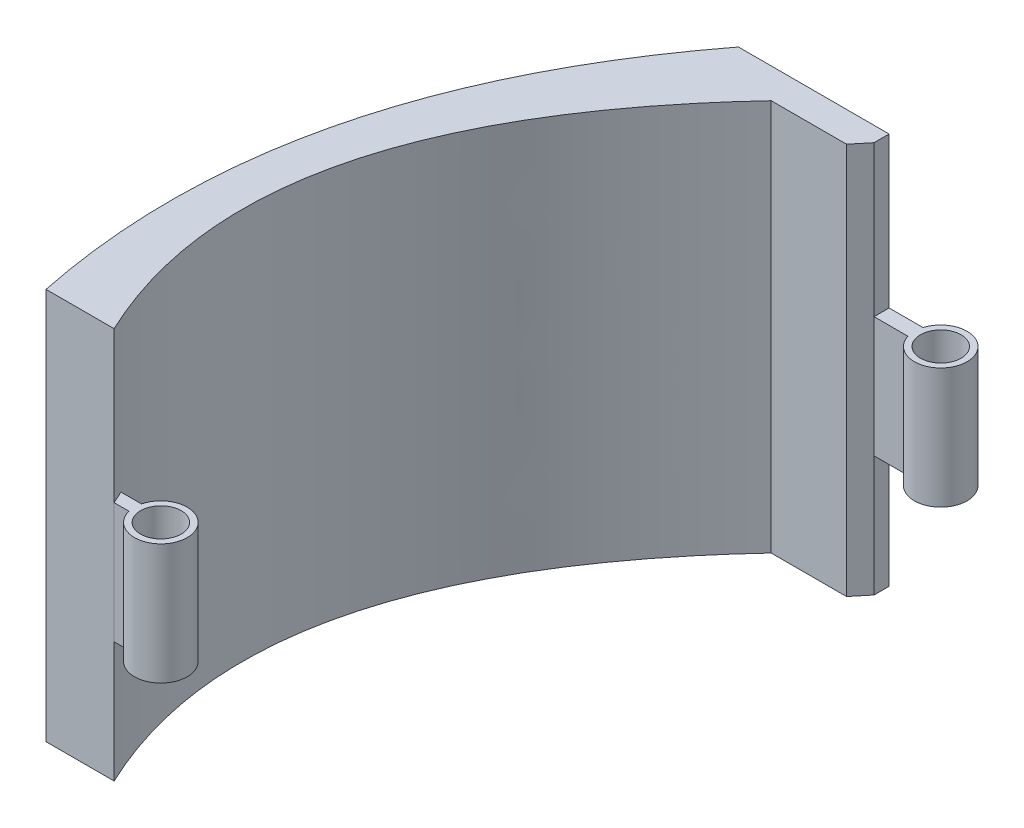
ISO-10303-21;
HEADER;
FILE_DESCRIPTION(('STEP AP214'),'2;1');
FILE_NAME('part.step','',(''),(''),'','','');
FILE_SCHEMA(('AUTOMOTIVE_DESIGN { 1 0 10303 214 1 1 1 1 }'));
ENDSEC;
DATA;
#1=APPLICATION_CONTEXT('core data for automotive mechanical design processes');
#2=APPLICATION_PROTOCOL_DEFINITION('international standard','automotive_design',2000,#1);
#3=PRODUCT_CONTEXT('',#1,'mechanical');
#4=PRODUCT('Part','Part','',(#3));
#5=PRODUCT_RELATED_PRODUCT_CATEGORY('part','',(#4));
#6=PRODUCT_DEFINITION_FORMATION('','',#4);
#7=PRODUCT_DEFINITION_CONTEXT('part definition',#1,'design');
#8=PRODUCT_DEFINITION('design','',#6,#7);
#9=PRODUCT_DEFINITION_SHAPE('','',#8);
#10=(LENGTH_UNIT() NAMED_UNIT(*) SI_UNIT(.MILLI.,.METRE.));
#11=(NAMED_UNIT(*) PLANE_ANGLE_UNIT() SI_UNIT($,.RADIAN.));
#12=(NAMED_UNIT(*) SI_UNIT($,.STERADIAN.) SOLID_ANGLE_UNIT());
#13=UNCERTAINTY_MEASURE_WITH_UNIT(LENGTH_MEASURE(1.E-05),#10,'distance_accuracy_value','');
#14=(GEOMETRIC_REPRESENTATION_CONTEXT(3) GLOBAL_UNCERTAINTY_ASSIGNED_CONTEXT((#13)) GLOBAL_UNIT_ASSIGNED_CONTEXT((#10,
#11,#12)) REPRESENTATION_CONTEXT('',''));
#15=CARTESIAN_POINT('',(0.,0.,0.));
#16=DIRECTION('',(0.,0.,1.));
#17=DIRECTION('',(1.,0.,0.));
#18=AXIS2_PLACEMENT_3D('',#15,#16,#17);
#19=CARTESIAN_POINT('',(-0.380093584955196,8.,-0.835205753797301));
#20=DIRECTION('',(-0.910179756080208,0.,0.414213485562425));
#21=DIRECTION('',(0.414213485562425,0.,0.910179756080208));
#22=AXIS2_PLACEMENT_3D('',#19,#20,#21);
#23=PLANE('',#22);
#24=CARTESIAN_POINT('',(-0.380093584955196,16.,-0.835205753797301));
#25=CARTESIAN_POINT('',(0.,16.,0.));
#26=B_SPLINE_CURVE_WITH_KNOTS('',1,(#24,#25),.UNSPECIFIED.,.F.,.F.,(2,2),(0.,1.),.UNSPECIFIED.);
#27=CARTESIAN_POINT('',(-0.380093584955196,16.,-0.835205753797301));
#28=VERTEX_POINT('',#27);
#29=CARTESIAN_POINT('',(0.,16.,0.));
#30=VERTEX_POINT('',#29);
#31=EDGE_CURVE('E114',#28,#30,#26,.T.);
#32=ORIENTED_EDGE('',*,*,#31,.F.);
#33=DIRECTION('',(0.,1.,0.));
#34=VECTOR('',#33,1.);
#35=CARTESIAN_POINT('',(-0.380093584955196,8.,-0.835205753797301));
#36=LINE('',#35,#34);
#37=CARTESIAN_POINT('',(-0.380093584955196,8.,-0.835205753797301));
#38=VERTEX_POINT('',#37);
#39=EDGE_CURVE('E12',#38,#28,#36,.T.);
#40=ORIENTED_EDGE('',*,*,#39,.F.);
#41=CARTESIAN_POINT('',(-0.380093584955196,8.,-0.835205753797301));
#42=CARTESIAN_POINT('',(0.,8.,0.));
#43=B_SPLINE_CURVE_WITH_KNOTS('',1,(#41,#42),.UNSPECIFIED.,.F.,.F.,(2,2),(0.,1.),.UNSPECIFIED.);
#44=CARTESIAN_POINT('',(0.,8.,0.));
#45=VERTEX_POINT('',#44);
#46=EDGE_CURVE('E105',#38,#45,#43,.T.);
#47=ORIENTED_EDGE('',*,*,#46,.T.);
#48=DIRECTION('',(0.,1.,0.));
#49=VECTOR('',#48,1.);
#50=CARTESIAN_POINT('',(0.,8.,0.));
#51=LINE('',#50,#49);
#52=EDGE_CURVE('E50',#45,#30,#51,.T.);
#53=ORIENTED_EDGE('',*,*,#52,.T.);
#54=EDGE_LOOP('',(#32,#40,#47,#53));
#55=FACE_BOUND('',#54,.T.);
#56=ADVANCED_FACE('F47',(#55),#23,.T.);
#57=CARTESIAN_POINT('',(-0.380093584955196,8.,-0.835205753797301));
#58=DIRECTION('',(0.,0.,-1.));
#59=DIRECTION('',(-1.,0.,0.));
#60=AXIS2_PLACEMENT_3D('',#57,#58,#59);
#61=PLANE('',#60);
#62=DIRECTION('',(-1.,0.,0.));
#63=VECTOR('',#62,1.);
#64=CARTESIAN_POINT('',(-0.380093584955196,16.,-0.835205753797301));
#65=LINE('',#64,#63);
#66=CARTESIAN_POINT('',(0.98695567083012,16.,-0.835205753797301));
#67=VERTEX_POINT('',#66);
#68=EDGE_CURVE('E107',#67,#28,#65,.T.);
#69=ORIENTED_EDGE('',*,*,#68,.F.);
#70=DIRECTION('',(0.,1.,0.));
#71=VECTOR('',#70,1.);
#72=CARTESIAN_POINT('',(0.98695567083012,8.,-0.835205753797301));
#73=LINE('',#72,#71);
#74=CARTESIAN_POINT('',(0.98695567083012,8.,-0.835205753797301));
#75=VERTEX_POINT('',#74);
#76=EDGE_CURVE('E56',#75,#67,#73,.T.);
#77=ORIENTED_EDGE('',*,*,#76,.F.);
#78=DIRECTION('',(-1.,0.,0.));
#79=VECTOR('',#78,1.);
#80=CARTESIAN_POINT('',(-0.380093584955196,8.,-0.835205753797301));
#81=LINE('',#80,#79);
#82=EDGE_CURVE('E102',#75,#38,#81,.T.);
#83=ORIENTED_EDGE('',*,*,#82,.T.);
#84=ORIENTED_EDGE('',*,*,#39,.T.);
#85=EDGE_LOOP('',(#69,#77,#83,#84));
#86=FACE_BOUND('',#85,.T.);
#87=ADVANCED_FACE('F130',(#86),#61,.T.);
#88=CARTESIAN_POINT('',(2.68639906123946,8.,-0.417602876898651));
#89=DIRECTION('',(0.,1.,0.));
#90=DIRECTION('',(0.,0.,1.));
#91=AXIS2_PLACEMENT_3D('',#88,#89,#90);
#92=CYLINDRICAL_SURFACE('',#91,1.75);
#93=CARTESIAN_POINT('',(2.68639906123946,16.,-0.417602876898651));
#94=DIRECTION('',(0.,1.,0.));
#95=DIRECTION('',(0.,0.,1.));
#96=AXIS2_PLACEMENT_3D('',#93,#94,#95);
#97=CIRCLE('',#96,1.75);
#98=CARTESIAN_POINT('',(0.98695567083012,16.,0.));
#99=VERTEX_POINT('',#98);
#100=EDGE_CURVE('E97',#99,#67,#97,.T.);
#101=ORIENTED_EDGE('',*,*,#100,.F.);
#102=DIRECTION('',(0.,1.,0.));
#103=VECTOR('',#102,1.);
#104=CARTESIAN_POINT('',(0.98695567083012,8.,0.));
#105=LINE('',#104,#103);
#106=CARTESIAN_POINT('',(0.98695567083012,8.,0.));
#107=VERTEX_POINT('',#106);
#108=EDGE_CURVE('E92',#107,#99,#105,.T.);
#109=ORIENTED_EDGE('',*,*,#108,.F.);
#110=CARTESIAN_POINT('',(2.68639906123946,8.,-0.417602876898651));
#111=DIRECTION('',(0.,1.,0.));
#112=DIRECTION('',(0.,0.,1.));
#113=AXIS2_PLACEMENT_3D('',#110,#111,#112);
#114=CIRCLE('',#113,1.75);
#115=EDGE_CURVE('E95',#107,#75,#114,.T.);
#116=ORIENTED_EDGE('',*,*,#115,.T.);
#117=ORIENTED_EDGE('',*,*,#76,.T.);
#118=EDGE_LOOP('',(#101,#109,#116,#117));
#119=FACE_BOUND('',#118,.T.);
#120=ADVANCED_FACE('F94',(#119),#92,.T.);
#121=CARTESIAN_POINT('',(0.98695567083012,8.,0.));
#122=DIRECTION('',(0.,0.,1.));
#123=DIRECTION('',(1.,0.,0.));
#124=AXIS2_PLACEMENT_3D('',#121,#122,#123);
#125=PLANE('',#124);
#126=DIRECTION('',(1.,0.,0.));
#127=VECTOR('',#126,1.);
#128=CARTESIAN_POINT('',(0.98695567083012,16.,0.));
#129=LINE('',#128,#127);
#130=EDGE_CURVE('E119',#30,#99,#129,.T.);
#131=ORIENTED_EDGE('',*,*,#130,.F.);
#132=ORIENTED_EDGE('',*,*,#52,.F.);
#133=DIRECTION('',(1.,0.,0.));
#134=VECTOR('',#133,1.);
#135=CARTESIAN_POINT('',(0.98695567083012,8.,0.));
#136=LINE('',#135,#134);
#137=EDGE_CURVE('E101',#45,#107,#136,.T.);
#138=ORIENTED_EDGE('',*,*,#137,.T.);
#139=ORIENTED_EDGE('',*,*,#108,.T.);
#140=EDGE_LOOP('',(#131,#132,#138,#139));
#141=FACE_BOUND('',#140,.T.);
#142=ADVANCED_FACE('F104',(#141),#125,.T.);
#143=CARTESIAN_POINT('',(2.68639906123946,8.,-0.417602876898651));
#144=DIRECTION('',(0.,1.,0.));
#145=DIRECTION('',(0.,0.,1.));
#146=AXIS2_PLACEMENT_3D('',#143,#144,#145);
#147=PLANE('',#146);
#148=CARTESIAN_POINT('',(2.68639906123946,8.,-0.417602876898651));
#149=DIRECTION('',(0.,1.,0.));
#150=DIRECTION('',(0.,0.,1.));
#151=AXIS2_PLACEMENT_3D('',#148,#149,#150);
#152=CIRCLE('',#151,1.35);
#153=CARTESIAN_POINT('',(2.68639906123946,8.,0.93239712310135));
#154=VERTEX_POINT('',#153);
#155=EDGE_CURVE('E120',#154,#154,#152,.T.);
#156=ORIENTED_EDGE('',*,*,#155,.T.);
#157=EDGE_LOOP('',(#156));
#158=FACE_BOUND('',#157,.T.);
#159=ORIENTED_EDGE('',*,*,#46,.F.);
#160=ORIENTED_EDGE('',*,*,#82,.F.);
#161=ORIENTED_EDGE('',*,*,#115,.F.);
#162=ORIENTED_EDGE('',*,*,#137,.F.);
#163=EDGE_LOOP('',(#159,#160,#161,#162));
#164=FACE_BOUND('',#163,.T.);
#165=ADVANCED_FACE('F100',(#158,#164),#147,.F.);
#166=CARTESIAN_POINT('',(2.68639906123946,16.,-0.417602876898651));
#167=DIRECTION('',(0.,1.,0.));
#168=DIRECTION('',(0.,0.,1.));
#169=AXIS2_PLACEMENT_3D('',#166,#167,#168);
#170=PLANE('',#169);
#171=CARTESIAN_POINT('',(2.68639906123946,16.,-0.417602876898651));
#172=DIRECTION('',(0.,1.,0.));
#173=DIRECTION('',(0.,0.,1.));
#174=AXIS2_PLACEMENT_3D('',#171,#172,#173);
#175=CIRCLE('',#174,1.35);
#176=CARTESIAN_POINT('',(2.68639906123946,16.,0.93239712310135));
#177=VERTEX_POINT('',#176);
#178=EDGE_CURVE('E159',#177,#177,#175,.T.);
#179=ORIENTED_EDGE('',*,*,#178,.F.);
#180=EDGE_LOOP('',(#179));
#181=FACE_BOUND('',#180,.T.);
#182=ORIENTED_EDGE('',*,*,#31,.T.);
#183=ORIENTED_EDGE('',*,*,#130,.T.);
#184=ORIENTED_EDGE('',*,*,#100,.T.);
#185=ORIENTED_EDGE('',*,*,#68,.T.);
#186=EDGE_LOOP('',(#182,#183,#184,#185));
#187=FACE_BOUND('',#186,.T.);
#188=ADVANCED_FACE('F129',(#181,#187),#170,.T.);
#189=CARTESIAN_POINT('',(2.68639906123946,0.,-0.417602876898651));
#190=DIRECTION('',(0.,1.,0.));
#191=DIRECTION('',(0.,0.,1.));
#192=AXIS2_PLACEMENT_3D('',#189,#190,#191);
#193=CYLINDRICAL_SURFACE('',#192,1.35);
#194=ORIENTED_EDGE('',*,*,#178,.T.);
#195=EDGE_LOOP('',(#194));
#196=FACE_BOUND('',#195,.T.);
#197=ORIENTED_EDGE('',*,*,#155,.F.);
#198=EDGE_LOOP('',(#197));
#199=FACE_BOUND('',#198,.T.);
#200=ADVANCED_FACE('F148',(#196,#199),#193,.F.);
#201=CLOSED_SHELL('',(#56,#87,#120,#142,#165,#188,#200));
#202=MANIFOLD_SOLID_BREP('B2',#201);
#203=CARTESIAN_POINT('',(14.5285083041094,26.,-36.9071862854208));
#204=DIRECTION('',(-1.,0.,0.));
#205=DIRECTION('',(0.,0.,1.));
#206=AXIS2_PLACEMENT_3D('',#203,#204,#205);
#207=PLANE('',#206);
#208=DIRECTION('',(0.,0.,1.));
#209=VECTOR('',#208,1.);
#210=CARTESIAN_POINT('',(14.5285083041094,16.,-35.9071862854208));
#211=LINE('',#210,#209);
#212=CARTESIAN_POINT('',(14.5285083041094,16.,-36.9071862854208));
#213=VERTEX_POINT('',#212);
#214=CARTESIAN_POINT('',(14.5285083041094,16.,-35.9071862854208));
#215=VERTEX_POINT('',#214);
#216=EDGE_CURVE('E379',#213,#215,#211,.T.);
#217=ORIENTED_EDGE('',*,*,#216,.F.);
#218=DIRECTION('',(0.,-1.,0.));
#219=VECTOR('',#218,1.);
#220=CARTESIAN_POINT('',(14.5285083041094,26.,-36.9071862854208));
#221=LINE('',#220,#219);
#222=CARTESIAN_POINT('',(14.5285083041094,26.,-36.9071862854208));
#223=VERTEX_POINT('',#222);
#224=EDGE_CURVE('E303',#223,#213,#221,.T.);
#225=ORIENTED_EDGE('',*,*,#224,.F.);
#226=DIRECTION('',(0.,0.,-1.));
#227=VECTOR('',#226,1.);
#228=CARTESIAN_POINT('',(14.5285083041094,26.,-36.9071862854208));
#229=LINE('',#228,#227);
#230=CARTESIAN_POINT('',(14.5285083041094,26.,-35.9071862854208));
#231=VERTEX_POINT('',#230);
#232=EDGE_CURVE('E281',#231,#223,#229,.T.);
#233=ORIENTED_EDGE('',*,*,#232,.F.);
#234=DIRECTION('',(0.,-1.,0.));
#235=VECTOR('',#234,1.);
#236=CARTESIAN_POINT('',(14.5285083041094,26.,-35.9071862854208));
#237=LINE('',#236,#235);
#238=EDGE_CURVE('E291',#231,#215,#237,.T.);
#239=ORIENTED_EDGE('',*,*,#238,.T.);
#240=EDGE_LOOP('',(#217,#225,#233,#239));
#241=FACE_BOUND('',#240,.T.);
#242=ADVANCED_FACE('F202',(#241),#207,.F.);
#243=CARTESIAN_POINT('',(4.52850830410939,26.,-36.9071862854208));
#244=CARTESIAN_POINT('',(-8.60017280516398,26.,-19.7975756336284));
#245=CARTESIAN_POINT('',(-4.51912124695227,26.,0.));
#246=B_SPLINE_CURVE_WITH_KNOTS('',2,(#243,#244,#245),.UNSPECIFIED.,.F.,.F.,(3,3),(0.,1.),.UNSPECIFIED.);
#247=DIRECTION('',(0.,-1.,0.));
#248=VECTOR('',#247,1.);
#249=SURFACE_OF_LINEAR_EXTRUSION('',#246,#248);
#250=CARTESIAN_POINT('',(4.52850830410939,0.,-36.9071862854208));
#251=CARTESIAN_POINT('',(-8.60017280516398,0.,-19.7975756336284));
#252=CARTESIAN_POINT('',(-4.51912124695227,0.,0.));
#253=B_SPLINE_CURVE_WITH_KNOTS('',2,(#250,#251,#252),.UNSPECIFIED.,.F.,.F.,(3,3),(0.,1.),.UNSPECIFIED.);
#254=CARTESIAN_POINT('',(4.52850830410939,0.,-36.9071862854208));
#255=VERTEX_POINT('',#254);
#256=CARTESIAN_POINT('',(-4.51912124695227,0.,0.));
#257=VERTEX_POINT('',#256);
#258=EDGE_CURVE('E309',#255,#257,#253,.T.);
#259=ORIENTED_EDGE('',*,*,#258,.T.);
#260=DIRECTION('',(0.,-1.,0.));
#261=VECTOR('',#260,1.);
#262=CARTESIAN_POINT('',(-4.51912124695227,26.,0.));
#263=LINE('',#262,#261);
#264=CARTESIAN_POINT('',(-4.51912124695227,26.,0.));
#265=VERTEX_POINT('',#264);
#266=EDGE_CURVE('E45',#265,#257,#263,.T.);
#267=ORIENTED_EDGE('',*,*,#266,.F.);
#268=CARTESIAN_POINT('',(4.52850830410939,26.,-36.9071862854208));
#269=VERTEX_POINT('',#268);
#270=EDGE_CURVE('E335',#269,#265,#246,.T.);
#271=ORIENTED_EDGE('',*,*,#270,.F.);
#272=DIRECTION('',(0.,-1.,0.));
#273=VECTOR('',#272,1.);
#274=CARTESIAN_POINT('',(4.52850830410939,26.,-36.9071862854208));
#275=LINE('',#274,#273);
#276=EDGE_CURVE('E305',#269,#255,#275,.T.);
#277=ORIENTED_EDGE('',*,*,#276,.T.);
#278=EDGE_LOOP('',(#259,#267,#271,#277));
#279=FACE_BOUND('',#278,.T.);
#280=ADVANCED_FACE('F204',(#279),#249,.F.);
#281=CARTESIAN_POINT('',(-4.51912124695227,26.,0.));
#282=DIRECTION('',(0.,0.,-1.));
#283=DIRECTION('',(-1.,0.,0.));
#284=AXIS2_PLACEMENT_3D('',#281,#282,#283);
#285=PLANE('',#284);
#286=DIRECTION('',(1.,0.,0.));
#287=VECTOR('',#286,1.);
#288=CARTESIAN_POINT('',(-4.51912124695227,0.,0.));
#289=LINE('',#288,#287);
#290=CARTESIAN_POINT('',(0.,0.,0.));
#291=VERTEX_POINT('',#290);
#292=EDGE_CURVE('E314',#257,#291,#289,.T.);
#293=ORIENTED_EDGE('',*,*,#292,.T.);
#294=DIRECTION('',(0.,-1.,0.));
#295=VECTOR('',#294,1.);
#296=CARTESIAN_POINT('',(0.,26.,0.));
#297=LINE('',#296,#295);
#298=CARTESIAN_POINT('',(0.,26.,0.));
#299=VERTEX_POINT('',#298);
#300=EDGE_CURVE('E211',#299,#291,#297,.T.);
#301=ORIENTED_EDGE('',*,*,#300,.F.);
#302=DIRECTION('',(1.,0.,0.));
#303=VECTOR('',#302,1.);
#304=CARTESIAN_POINT('',(-4.51912124695227,26.,0.));
#305=LINE('',#304,#303);
#306=EDGE_CURVE('E264',#265,#299,#305,.T.);
#307=ORIENTED_EDGE('',*,*,#306,.F.);
#308=ORIENTED_EDGE('',*,*,#266,.T.);
#309=EDGE_LOOP('',(#293,#301,#307,#308));
#310=FACE_BOUND('',#309,.T.);
#311=ADVANCED_FACE('F409',(#310),#285,.F.);
#312=CARTESIAN_POINT('',(0.,26.,0.));
#313=CARTESIAN_POINT('',(-8.04789533432413,26.,-17.0045130847505));
#314=CARTESIAN_POINT('',(8.70204481317038,26.,-34.9071862854208));
#315=B_SPLINE_CURVE_WITH_KNOTS('',2,(#312,#313,#314),.UNSPECIFIED.,.F.,.F.,(3,3),(0.,1.),.UNSPECIFIED.);
#316=DIRECTION('',(0.,-1.,0.));
#317=VECTOR('',#316,1.);
#318=SURFACE_OF_LINEAR_EXTRUSION('',#315,#317);
#319=CARTESIAN_POINT('',(0.,0.,0.));
#320=CARTESIAN_POINT('',(-8.04789533432413,0.,-17.0045130847505));
#321=CARTESIAN_POINT('',(8.70204481317038,0.,-34.9071862854208));
#322=B_SPLINE_CURVE_WITH_KNOTS('',2,(#319,#320,#321),.UNSPECIFIED.,.F.,.F.,(3,3),(0.,1.),.UNSPECIFIED.);
#323=CARTESIAN_POINT('',(8.70204481317038,0.,-34.9071862854208));
#324=VERTEX_POINT('',#323);
#325=EDGE_CURVE('E320',#291,#324,#322,.T.);
#326=ORIENTED_EDGE('',*,*,#325,.T.);
#327=DIRECTION('',(0.,-1.,0.));
#328=VECTOR('',#327,1.);
#329=CARTESIAN_POINT('',(8.70204481317038,26.,-34.9071862854208));
#330=LINE('',#329,#328);
#331=CARTESIAN_POINT('',(8.70204481317038,26.,-34.9071862854208));
#332=VERTEX_POINT('',#331);
#333=EDGE_CURVE('E340',#332,#324,#330,.T.);
#334=ORIENTED_EDGE('',*,*,#333,.F.);
#335=EDGE_CURVE('E348',#299,#332,#315,.T.);
#336=ORIENTED_EDGE('',*,*,#335,.F.);
#337=ORIENTED_EDGE('',*,*,#300,.T.);
#338=EDGE_LOOP('',(#326,#334,#336,#337));
#339=FACE_BOUND('',#338,.T.);
#340=ADVANCED_FACE('F346',(#339),#318,.F.);
#341=CARTESIAN_POINT('',(13.7020448131704,26.,-34.9071862854208));
#342=DIRECTION('',(0.,0.,-1.));
#343=DIRECTION('',(-1.,0.,0.));
#344=AXIS2_PLACEMENT_3D('',#341,#342,#343);
#345=PLANE('',#344);
#346=DIRECTION('',(1.,0.,0.));
#347=VECTOR('',#346,1.);
#348=CARTESIAN_POINT('',(13.7020448131704,0.,-34.9071862854208));
#349=LINE('',#348,#347);
#350=CARTESIAN_POINT('',(13.7020448131704,0.,-34.9071862854208));
#351=VERTEX_POINT('',#350);
#352=EDGE_CURVE('E324',#324,#351,#349,.T.);
#353=ORIENTED_EDGE('',*,*,#352,.T.);
#354=DIRECTION('',(0.,-1.,0.));
#355=VECTOR('',#354,1.);
#356=CARTESIAN_POINT('',(13.7020448131704,26.,-34.9071862854208));
#357=LINE('',#356,#355);
#358=CARTESIAN_POINT('',(13.7020448131704,26.,-34.9071862854208));
#359=VERTEX_POINT('',#358);
#360=EDGE_CURVE('E299',#359,#351,#357,.T.);
#361=ORIENTED_EDGE('',*,*,#360,.F.);
#362=DIRECTION('',(1.,0.,0.));
#363=VECTOR('',#362,1.);
#364=CARTESIAN_POINT('',(13.7020448131704,26.,-34.9071862854208));
#365=LINE('',#364,#363);
#366=EDGE_CURVE('E284',#332,#359,#365,.T.);
#367=ORIENTED_EDGE('',*,*,#366,.F.);
#368=ORIENTED_EDGE('',*,*,#333,.T.);
#369=EDGE_LOOP('',(#353,#361,#367,#368));
#370=FACE_BOUND('',#369,.T.);
#371=ADVANCED_FACE('F356',(#370),#345,.F.);
#372=CARTESIAN_POINT('',(14.5285083041094,26.,-35.9071862854208));
#373=DIRECTION('',(-0.770819221241379,0.,-0.637053944470037));
#374=DIRECTION('',(-0.637053944470037,0.,0.77081922124138));
#375=AXIS2_PLACEMENT_3D('',#372,#373,#374);
#376=PLANE('',#375);
#377=DIRECTION('',(0.637053944470037,0.,-0.770819221241379));
#378=VECTOR('',#377,1.);
#379=CARTESIAN_POINT('',(14.5285083041094,0.,-35.9071862854208));
#380=LINE('',#379,#378);
#381=CARTESIAN_POINT('',(14.5285083041094,0.,-35.9071862854208));
#382=VERTEX_POINT('',#381);
#383=EDGE_CURVE('E329',#351,#382,#380,.T.);
#384=ORIENTED_EDGE('',*,*,#383,.T.);
#385=CARTESIAN_POINT('',(14.5285083041094,8.00000000000001,-35.9071862854208));
#386=VERTEX_POINT('',#385);
#387=EDGE_CURVE('E300',#386,#382,#237,.T.);
#388=ORIENTED_EDGE('',*,*,#387,.F.);
#389=DIRECTION('',(0.,1.,0.));
#390=VECTOR('',#389,1.);
#391=CARTESIAN_POINT('',(14.5285083041094,8.,-35.9071862854208));
#392=LINE('',#391,#390);
#393=EDGE_CURVE('E296',#386,#215,#392,.T.);
#394=ORIENTED_EDGE('',*,*,#393,.T.);
#395=ORIENTED_EDGE('',*,*,#238,.F.);
#396=DIRECTION('',(0.637053944470037,0.,-0.770819221241379));
#397=VECTOR('',#396,1.);
#398=CARTESIAN_POINT('',(14.5285083041094,26.,-35.9071862854208));
#399=LINE('',#398,#397);
#400=EDGE_CURVE('E277',#359,#231,#399,.T.);
#401=ORIENTED_EDGE('',*,*,#400,.F.);
#402=ORIENTED_EDGE('',*,*,#360,.T.);
#403=EDGE_LOOP('',(#384,#388,#394,#395,#401,#402));
#404=FACE_BOUND('',#403,.T.);
#405=ADVANCED_FACE('F293',(#404),#376,.F.);
#406=CARTESIAN_POINT('',(14.5285083041094,8.,-36.9071862854208));
#407=VERTEX_POINT('',#406);
#408=CARTESIAN_POINT('',(14.5285083041094,0.,-36.9071862854208));
#409=VERTEX_POINT('',#408);
#410=EDGE_CURVE('E337',#407,#409,#221,.T.);
#411=ORIENTED_EDGE('',*,*,#410,.F.);
#412=DIRECTION('',(0.,0.,1.));
#413=VECTOR('',#412,1.);
#414=CARTESIAN_POINT('',(14.5285083041094,8.,-35.9071862854208));
#415=LINE('',#414,#413);
#416=EDGE_CURVE('E361',#407,#386,#415,.T.);
#417=ORIENTED_EDGE('',*,*,#416,.T.);
#418=ORIENTED_EDGE('',*,*,#387,.T.);
#419=DIRECTION('',(0.,0.,-1.));
#420=VECTOR('',#419,1.);
#421=CARTESIAN_POINT('',(14.5285083041094,0.,-36.9071862854208));
#422=LINE('',#421,#420);
#423=EDGE_CURVE('E331',#382,#409,#422,.T.);
#424=ORIENTED_EDGE('',*,*,#423,.T.);
#425=EDGE_LOOP('',(#411,#417,#418,#424));
#426=FACE_BOUND('',#425,.T.);
#427=ADVANCED_FACE('F359',(#426),#207,.F.);
#428=CARTESIAN_POINT('',(4.52850830410939,26.,-36.9071862854208));
#429=DIRECTION('',(0.,0.,1.));
#430=DIRECTION('',(1.,0.,0.));
#431=AXIS2_PLACEMENT_3D('',#428,#429,#430);
#432=PLANE('',#431);
#433=DIRECTION('',(-1.,0.,0.));
#434=VECTOR('',#433,1.);
#435=CARTESIAN_POINT('',(4.52850830410939,0.,-36.9071862854208));
#436=LINE('',#435,#434);
#437=EDGE_CURVE('E256',#409,#255,#436,.T.);
#438=ORIENTED_EDGE('',*,*,#437,.T.);
#439=ORIENTED_EDGE('',*,*,#276,.F.);
#440=DIRECTION('',(-1.,0.,0.));
#441=VECTOR('',#440,1.);
#442=CARTESIAN_POINT('',(4.52850830410939,26.,-36.9071862854208));
#443=LINE('',#442,#441);
#444=EDGE_CURVE('E227',#223,#269,#443,.T.);
#445=ORIENTED_EDGE('',*,*,#444,.F.);
#446=ORIENTED_EDGE('',*,*,#224,.T.);
#447=DIRECTION('',(-1.,0.,0.));
#448=VECTOR('',#447,1.);
#449=CARTESIAN_POINT('',(14.5285083041094,16.,-36.9071862854208));
#450=LINE('',#449,#448);
#451=CARTESIAN_POINT('',(16.7785083041094,16.,-36.9071862854208));
#452=VERTEX_POINT('',#451);
#453=EDGE_CURVE('E364',#452,#213,#450,.T.);
#454=ORIENTED_EDGE('',*,*,#453,.F.);
#455=DIRECTION('',(0.,1.,0.));
#456=VECTOR('',#455,1.);
#457=CARTESIAN_POINT('',(16.7785083041094,8.,-36.9071862854208));
#458=LINE('',#457,#456);
#459=CARTESIAN_POINT('',(16.7785083041094,8.,-36.9071862854208));
#460=VERTEX_POINT('',#459);
#461=EDGE_CURVE('E315',#460,#452,#458,.T.);
#462=ORIENTED_EDGE('',*,*,#461,.F.);
#463=DIRECTION('',(-1.,0.,0.));
#464=VECTOR('',#463,1.);
#465=CARTESIAN_POINT('',(14.5285083041094,8.,-36.9071862854208));
#466=LINE('',#465,#464);
#467=EDGE_CURVE('E377',#460,#407,#466,.T.);
#468=ORIENTED_EDGE('',*,*,#467,.T.);
#469=ORIENTED_EDGE('',*,*,#410,.T.);
#470=EDGE_LOOP('',(#438,#439,#445,#446,#454,#462,#468,#469));
#471=FACE_BOUND('',#470,.T.);
#472=ADVANCED_FACE('F422',(#471),#432,.F.);
#473=CARTESIAN_POINT('',(-4.29773963829271,26.,-19.1255843881694));
#474=DIRECTION('',(0.,1.,0.));
#475=DIRECTION('',(0.,0.,1.));
#476=AXIS2_PLACEMENT_3D('',#473,#474,#475);
#477=PLANE('',#476);
#478=ORIENTED_EDGE('',*,*,#270,.T.);
#479=ORIENTED_EDGE('',*,*,#306,.T.);
#480=ORIENTED_EDGE('',*,*,#335,.T.);
#481=ORIENTED_EDGE('',*,*,#366,.T.);
#482=ORIENTED_EDGE('',*,*,#400,.T.);
#483=ORIENTED_EDGE('',*,*,#232,.T.);
#484=ORIENTED_EDGE('',*,*,#444,.T.);
#485=EDGE_LOOP('',(#478,#479,#480,#481,#482,#483,#484));
#486=FACE_BOUND('',#485,.T.);
#487=ADVANCED_FACE('F279',(#486),#477,.T.);
#488=CARTESIAN_POINT('',(-4.29773963829271,0.,-19.1255843881694));
#489=DIRECTION('',(0.,1.,0.));
#490=DIRECTION('',(0.,0.,1.));
#491=AXIS2_PLACEMENT_3D('',#488,#489,#490);
#492=PLANE('',#491);
#493=ORIENTED_EDGE('',*,*,#258,.F.);
#494=ORIENTED_EDGE('',*,*,#437,.F.);
#495=ORIENTED_EDGE('',*,*,#423,.F.);
#496=ORIENTED_EDGE('',*,*,#383,.F.);
#497=ORIENTED_EDGE('',*,*,#352,.F.);
#498=ORIENTED_EDGE('',*,*,#325,.F.);
#499=ORIENTED_EDGE('',*,*,#292,.F.);
#500=EDGE_LOOP('',(#493,#494,#495,#496,#497,#498,#499));
#501=FACE_BOUND('',#500,.T.);
#502=ADVANCED_FACE('F352',(#501),#492,.F.);
#503=CARTESIAN_POINT('',(18.4555592872342,8.,-36.4071862854208));
#504=DIRECTION('',(0.,1.,0.));
#505=DIRECTION('',(0.,0.,1.));
#506=AXIS2_PLACEMENT_3D('',#503,#504,#505);
#507=CYLINDRICAL_SURFACE('',#506,1.75);
#508=CARTESIAN_POINT('',(18.4555592872342,16.,-36.4071862854208));
#509=DIRECTION('',(0.,1.,0.));
#510=DIRECTION('',(0.,0.,1.));
#511=AXIS2_PLACEMENT_3D('',#508,#509,#510);
#512=CIRCLE('',#511,1.75);
#513=CARTESIAN_POINT('',(16.7785083041094,16.,-35.9071862854208));
#514=VERTEX_POINT('',#513);
#515=EDGE_CURVE('E369',#514,#452,#512,.T.);
#516=ORIENTED_EDGE('',*,*,#515,.F.);
#517=DIRECTION('',(0.,1.,0.));
#518=VECTOR('',#517,1.);
#519=CARTESIAN_POINT('',(16.7785083041094,8.,-35.9071862854208));
#520=LINE('',#519,#518);
#521=CARTESIAN_POINT('',(16.7785083041094,8.,-35.9071862854208));
#522=VERTEX_POINT('',#521);
#523=EDGE_CURVE('E389',#522,#514,#520,.T.);
#524=ORIENTED_EDGE('',*,*,#523,.F.);
#525=CARTESIAN_POINT('',(18.4555592872342,8.,-36.4071862854208));
#526=DIRECTION('',(0.,1.,0.));
#527=DIRECTION('',(0.,0.,1.));
#528=AXIS2_PLACEMENT_3D('',#525,#526,#527);
#529=CIRCLE('',#528,1.75);
#530=EDGE_CURVE('E366',#522,#460,#529,.T.);
#531=ORIENTED_EDGE('',*,*,#530,.T.);
#532=ORIENTED_EDGE('',*,*,#461,.T.);
#533=EDGE_LOOP('',(#516,#524,#531,#532));
#534=FACE_BOUND('',#533,.T.);
#535=ADVANCED_FACE('F481',(#534),#507,.T.);
#536=CARTESIAN_POINT('',(16.7785083041094,8.,-35.9071862854208));
#537=DIRECTION('',(0.,0.,1.));
#538=DIRECTION('',(1.,0.,0.));
#539=AXIS2_PLACEMENT_3D('',#536,#537,#538);
#540=PLANE('',#539);
#541=DIRECTION('',(1.,0.,0.));
#542=VECTOR('',#541,1.);
#543=CARTESIAN_POINT('',(16.7785083041094,16.,-35.9071862854208));
#544=LINE('',#543,#542);
#545=EDGE_CURVE('E382',#215,#514,#544,.T.);
#546=ORIENTED_EDGE('',*,*,#545,.F.);
#547=ORIENTED_EDGE('',*,*,#393,.F.);
#548=DIRECTION('',(1.,0.,0.));
#549=VECTOR('',#548,1.);
#550=CARTESIAN_POINT('',(16.7785083041094,8.,-35.9071862854208));
#551=LINE('',#550,#549);
#552=EDGE_CURVE('E218',#386,#522,#551,.T.);
#553=ORIENTED_EDGE('',*,*,#552,.T.);
#554=ORIENTED_EDGE('',*,*,#523,.T.);
#555=EDGE_LOOP('',(#546,#547,#553,#554));
#556=FACE_BOUND('',#555,.T.);
#557=ADVANCED_FACE('F493',(#556),#540,.T.);
#558=CARTESIAN_POINT('',(18.4555592872342,8.,-36.4071862854208));
#559=DIRECTION('',(0.,1.,0.));
#560=DIRECTION('',(0.,0.,1.));
#561=AXIS2_PLACEMENT_3D('',#558,#559,#560);
#562=PLANE('',#561);
#563=CARTESIAN_POINT('',(18.4555592872342,8.,-36.4071862854208));
#564=DIRECTION('',(0.,1.,0.));
#565=DIRECTION('',(0.,0.,1.));
#566=AXIS2_PLACEMENT_3D('',#563,#564,#565);
#567=CIRCLE('',#566,1.35);
#568=CARTESIAN_POINT('',(18.4555592872342,8.,-35.0571862854208));
#569=VERTEX_POINT('',#568);
#570=EDGE_CURVE('E372',#569,#569,#567,.T.);
#571=ORIENTED_EDGE('',*,*,#570,.T.);
#572=EDGE_LOOP('',(#571));
#573=FACE_BOUND('',#572,.T.);
#574=ORIENTED_EDGE('',*,*,#416,.F.);
#575=ORIENTED_EDGE('',*,*,#467,.F.);
#576=ORIENTED_EDGE('',*,*,#530,.F.);
#577=ORIENTED_EDGE('',*,*,#552,.F.);
#578=EDGE_LOOP('',(#574,#575,#576,#577));
#579=FACE_BOUND('',#578,.T.);
#580=ADVANCED_FACE('F500',(#573,#579),#562,.F.);
#581=CARTESIAN_POINT('',(18.4555592872342,16.,-36.4071862854208));
#582=DIRECTION('',(0.,1.,0.));
#583=DIRECTION('',(0.,0.,1.));
#584=AXIS2_PLACEMENT_3D('',#581,#582,#583);
#585=PLANE('',#584);
#586=CARTESIAN_POINT('',(18.4555592872342,16.,-36.4071862854208));
#587=DIRECTION('',(0.,1.,0.));
#588=DIRECTION('',(0.,0.,1.));
#589=AXIS2_PLACEMENT_3D('',#586,#587,#588);
#590=CIRCLE('',#589,1.35);
#591=CARTESIAN_POINT('',(18.4555592872342,16.,-35.0571862854208));
#592=VERTEX_POINT('',#591);
#593=EDGE_CURVE('E540',#592,#592,#590,.T.);
#594=ORIENTED_EDGE('',*,*,#593,.F.);
#595=EDGE_LOOP('',(#594));
#596=FACE_BOUND('',#595,.T.);
#597=ORIENTED_EDGE('',*,*,#216,.T.);
#598=ORIENTED_EDGE('',*,*,#545,.T.);
#599=ORIENTED_EDGE('',*,*,#515,.T.);
#600=ORIENTED_EDGE('',*,*,#453,.T.);
#601=EDGE_LOOP('',(#597,#598,#599,#600));
#602=FACE_BOUND('',#601,.T.);
#603=ADVANCED_FACE('F508',(#596,#602),#585,.T.);
#604=CARTESIAN_POINT('',(18.4555592872342,0.,-36.4071862854208));
#605=DIRECTION('',(0.,1.,0.));
#606=DIRECTION('',(0.,0.,1.));
#607=AXIS2_PLACEMENT_3D('',#604,#605,#606);
#608=CYLINDRICAL_SURFACE('',#607,1.35);
#609=ORIENTED_EDGE('',*,*,#593,.T.);
#610=EDGE_LOOP('',(#609));
#611=FACE_BOUND('',#610,.T.);
#612=ORIENTED_EDGE('',*,*,#570,.F.);
#613=EDGE_LOOP('',(#612));
#614=FACE_BOUND('',#613,.T.);
#615=ADVANCED_FACE('F516',(#611,#614),#608,.F.);
#616=CLOSED_SHELL('',(#242,#280,#311,#340,#371,#405,#427,#472,#487,#502,#535,#557,#580,#603,#615));
#617=MANIFOLD_SOLID_BREP('B6',#616);
#618=ADVANCED_BREP_SHAPE_REPRESENTATION('',(#18,#202,#617),#14);
#619=SHAPE_DEFINITION_REPRESENTATION(#9,#618);
ENDSEC;
END-ISO-10303-21;
